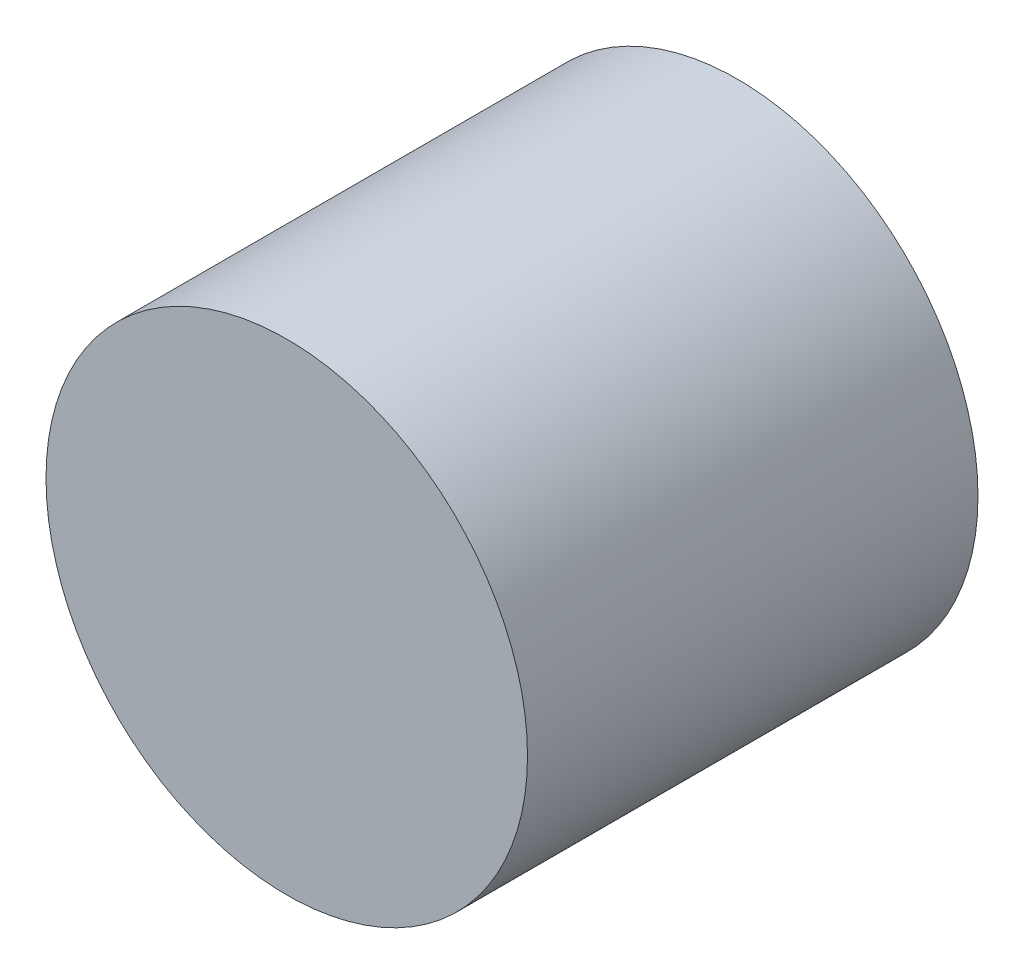
ISO-10303-21;
HEADER;
FILE_DESCRIPTION(('STEP AP214'),'2;1');
FILE_NAME('part.step','',(''),(''),'','','');
FILE_SCHEMA(('AUTOMOTIVE_DESIGN { 1 0 10303 214 1 1 1 1 }'));
ENDSEC;
DATA;
#1=APPLICATION_CONTEXT('core data for automotive mechanical design processes');
#2=APPLICATION_PROTOCOL_DEFINITION('international standard','automotive_design',2000,#1);
#3=PRODUCT_CONTEXT('',#1,'mechanical');
#4=PRODUCT('Part','Part','',(#3));
#5=PRODUCT_RELATED_PRODUCT_CATEGORY('part','',(#4));
#6=PRODUCT_DEFINITION_FORMATION('','',#4);
#7=PRODUCT_DEFINITION_CONTEXT('part definition',#1,'design');
#8=PRODUCT_DEFINITION('design','',#6,#7);
#9=PRODUCT_DEFINITION_SHAPE('','',#8);
#10=(LENGTH_UNIT() NAMED_UNIT(*) SI_UNIT(.MILLI.,.METRE.));
#11=(NAMED_UNIT(*) PLANE_ANGLE_UNIT() SI_UNIT($,.RADIAN.));
#12=(NAMED_UNIT(*) SI_UNIT($,.STERADIAN.) SOLID_ANGLE_UNIT());
#13=UNCERTAINTY_MEASURE_WITH_UNIT(LENGTH_MEASURE(1.E-05),#10,'distance_accuracy_value','');
#14=(GEOMETRIC_REPRESENTATION_CONTEXT(3) GLOBAL_UNCERTAINTY_ASSIGNED_CONTEXT((#13)) GLOBAL_UNIT_ASSIGNED_CONTEXT((#10,
#11,#12)) REPRESENTATION_CONTEXT('',''));
#15=CARTESIAN_POINT('',(0.,0.,0.));
#16=DIRECTION('',(0.,0.,1.));
#17=DIRECTION('',(1.,0.,0.));
#18=AXIS2_PLACEMENT_3D('',#15,#16,#17);
#19=CARTESIAN_POINT('',(0.,0.,4.67766733));
#20=DIRECTION('',(0.,0.,-1.));
#21=DIRECTION('',(-1.,0.,0.));
#22=AXIS2_PLACEMENT_3D('',#19,#20,#21);
#23=CYLINDRICAL_SURFACE('',#22,2.5);
#24=CARTESIAN_POINT('',(0.,0.,4.67766733));
#25=DIRECTION('',(0.,0.,1.));
#26=DIRECTION('',(1.,0.,0.));
#27=AXIS2_PLACEMENT_3D('',#24,#25,#26);
#28=CIRCLE('',#27,2.5);
#29=CARTESIAN_POINT('',(2.5,0.,4.67766733));
#30=VERTEX_POINT('',#29);
#31=EDGE_CURVE('E10',#30,#30,#28,.T.);
#32=ORIENTED_EDGE('',*,*,#31,.F.);
#33=EDGE_LOOP('',(#32));
#34=FACE_BOUND('',#33,.T.);
#35=CARTESIAN_POINT('',(0.,0.,0.));
#36=DIRECTION('',(0.,0.,1.));
#37=DIRECTION('',(1.,0.,0.));
#38=AXIS2_PLACEMENT_3D('',#35,#36,#37);
#39=CIRCLE('',#38,2.5);
#40=CARTESIAN_POINT('',(2.5,0.,0.));
#41=VERTEX_POINT('',#40);
#42=EDGE_CURVE('E38',#41,#41,#39,.T.);
#43=ORIENTED_EDGE('',*,*,#42,.T.);
#44=EDGE_LOOP('',(#43));
#45=FACE_BOUND('',#44,.T.);
#46=ADVANCED_FACE('F35',(#34,#45),#23,.T.);
#47=CARTESIAN_POINT('',(0.,0.,4.67766733));
#48=DIRECTION('',(0.,0.,1.));
#49=DIRECTION('',(1.,0.,0.));
#50=AXIS2_PLACEMENT_3D('',#47,#48,#49);
#51=PLANE('',#50);
#52=ORIENTED_EDGE('',*,*,#31,.T.);
#53=EDGE_LOOP('',(#52));
#54=FACE_BOUND('',#53,.T.);
#55=ADVANCED_FACE('F50',(#54),#51,.T.);
#56=CARTESIAN_POINT('',(0.,0.,0.));
#57=DIRECTION('',(0.,0.,1.));
#58=DIRECTION('',(1.,0.,0.));
#59=AXIS2_PLACEMENT_3D('',#56,#57,#58);
#60=PLANE('',#59);
#61=ORIENTED_EDGE('',*,*,#42,.F.);
#62=EDGE_LOOP('',(#61));
#63=FACE_BOUND('',#62,.T.);
#64=ADVANCED_FACE('F48',(#63),#60,.F.);
#65=CLOSED_SHELL('',(#46,#55,#64));
#66=MANIFOLD_SOLID_BREP('B2',#65);
#67=ADVANCED_BREP_SHAPE_REPRESENTATION('',(#18,#66),#14);
#68=SHAPE_DEFINITION_REPRESENTATION(#9,#67);
ENDSEC;
END-ISO-10303-21;
